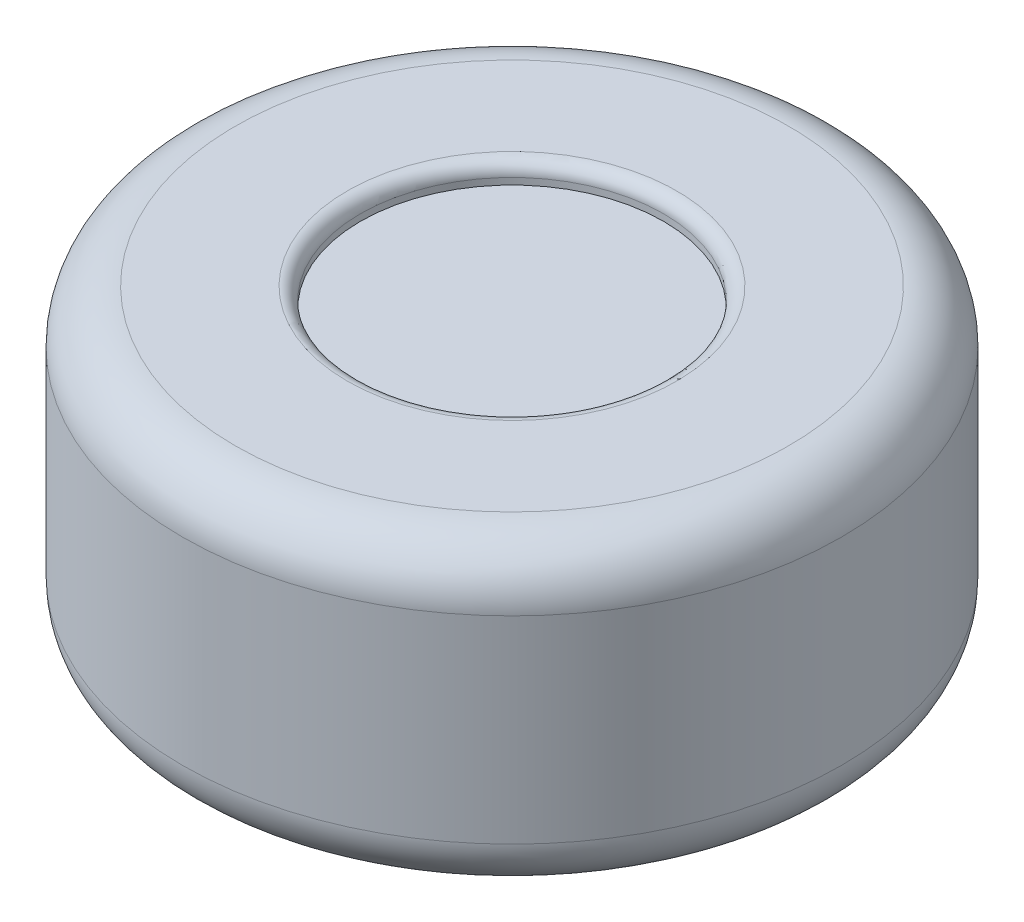
ISO-10303-21;
HEADER;
FILE_DESCRIPTION(('STEP AP214'),'2;1');
FILE_NAME('part.step','',(''),(''),'','','');
FILE_SCHEMA(('AUTOMOTIVE_DESIGN { 1 0 10303 214 1 1 1 1 }'));
ENDSEC;
DATA;
#1=APPLICATION_CONTEXT('core data for automotive mechanical design processes');
#2=APPLICATION_PROTOCOL_DEFINITION('international standard','automotive_design',2000,#1);
#3=PRODUCT_CONTEXT('',#1,'mechanical');
#4=PRODUCT('Part','Part','',(#3));
#5=PRODUCT_RELATED_PRODUCT_CATEGORY('part','',(#4));
#6=PRODUCT_DEFINITION_FORMATION('','',#4);
#7=PRODUCT_DEFINITION_CONTEXT('part definition',#1,'design');
#8=PRODUCT_DEFINITION('design','',#6,#7);
#9=PRODUCT_DEFINITION_SHAPE('','',#8);
#10=(LENGTH_UNIT() NAMED_UNIT(*) SI_UNIT(.MILLI.,.METRE.));
#11=(NAMED_UNIT(*) PLANE_ANGLE_UNIT() SI_UNIT($,.RADIAN.));
#12=(NAMED_UNIT(*) SI_UNIT($,.STERADIAN.) SOLID_ANGLE_UNIT());
#13=UNCERTAINTY_MEASURE_WITH_UNIT(LENGTH_MEASURE(1.E-05),#10,'distance_accuracy_value','');
#14=(GEOMETRIC_REPRESENTATION_CONTEXT(3) GLOBAL_UNCERTAINTY_ASSIGNED_CONTEXT((#13)) GLOBAL_UNIT_ASSIGNED_CONTEXT((#10,
#11,#12)) REPRESENTATION_CONTEXT('',''));
#15=CARTESIAN_POINT('',(0.,0.,0.));
#16=DIRECTION('',(0.,0.,1.));
#17=DIRECTION('',(1.,0.,0.));
#18=AXIS2_PLACEMENT_3D('',#15,#16,#17);
#19=CARTESIAN_POINT('',(0.,-115.,0.));
#20=DIRECTION('',(0.,1.,0.));
#21=DIRECTION('',(0.,0.,1.));
#22=AXIS2_PLACEMENT_3D('',#19,#20,#21);
#23=CYLINDRICAL_SURFACE('',#22,115.);
#24=CARTESIAN_POINT('',(0.,-105.,0.));
#25=DIRECTION('',(0.,1.,0.));
#26=DIRECTION('',(0.,0.,1.));
#27=AXIS2_PLACEMENT_3D('',#24,#25,#26);
#28=CIRCLE('',#27,115.);
#29=CARTESIAN_POINT('',(0.,-105.,115.));
#30=VERTEX_POINT('',#29);
#31=EDGE_CURVE('E50',#30,#30,#28,.F.);
#32=ORIENTED_EDGE('',*,*,#31,.T.);
#33=EDGE_LOOP('',(#32));
#34=FACE_BOUND('',#33,.T.);
#35=CARTESIAN_POINT('',(0.,-100.,0.));
#36=DIRECTION('',(0.,1.,0.));
#37=DIRECTION('',(0.,0.,1.));
#38=AXIS2_PLACEMENT_3D('',#35,#36,#37);
#39=CIRCLE('',#38,115.);
#40=CARTESIAN_POINT('',(0.,-100.,115.));
#41=VERTEX_POINT('',#40);
#42=EDGE_CURVE('E77',#41,#41,#39,.T.);
#43=ORIENTED_EDGE('',*,*,#42,.T.);
#44=EDGE_LOOP('',(#43));
#45=FACE_BOUND('',#44,.T.);
#46=ADVANCED_FACE('F37',(#34,#45),#23,.F.);
#47=CARTESIAN_POINT('',(0.,-115.,0.));
#48=DIRECTION('',(0.,1.,0.));
#49=DIRECTION('',(0.,0.,1.));
#50=AXIS2_PLACEMENT_3D('',#47,#48,#49);
#51=CYLINDRICAL_SURFACE('',#50,250.);
#52=CARTESIAN_POINT('',(0.,75.,0.));
#53=DIRECTION('',(0.,1.,0.));
#54=DIRECTION('',(0.,0.,1.));
#55=AXIS2_PLACEMENT_3D('',#52,#53,#54);
#56=CIRCLE('',#55,250.);
#57=CARTESIAN_POINT('',(0.,75.,250.));
#58=VERTEX_POINT('',#57);
#59=EDGE_CURVE('E65',#58,#58,#56,.F.);
#60=ORIENTED_EDGE('',*,*,#59,.T.);
#61=EDGE_LOOP('',(#60));
#62=FACE_BOUND('',#61,.T.);
#63=CARTESIAN_POINT('',(0.,-75.,0.));
#64=DIRECTION('',(0.,1.,0.));
#65=DIRECTION('',(0.,0.,1.));
#66=AXIS2_PLACEMENT_3D('',#63,#64,#65);
#67=CIRCLE('',#66,250.);
#68=CARTESIAN_POINT('',(0.,-75.,250.));
#69=VERTEX_POINT('',#68);
#70=EDGE_CURVE('E69',#69,#69,#67,.T.);
#71=ORIENTED_EDGE('',*,*,#70,.T.);
#72=EDGE_LOOP('',(#71));
#73=FACE_BOUND('',#72,.T.);
#74=ADVANCED_FACE('F103',(#62,#73),#51,.T.);
#75=CARTESIAN_POINT('',(0.,-115.,0.));
#76=DIRECTION('',(0.,1.,0.));
#77=DIRECTION('',(0.,0.,1.));
#78=AXIS2_PLACEMENT_3D('',#75,#76,#77);
#79=PLANE('',#78);
#80=CARTESIAN_POINT('',(0.,-115.,0.));
#81=DIRECTION('',(0.,1.,0.));
#82=DIRECTION('',(0.,0.,1.));
#83=AXIS2_PLACEMENT_3D('',#80,#81,#82);
#84=CIRCLE('',#83,125.);
#85=CARTESIAN_POINT('',(0.,-115.,125.));
#86=VERTEX_POINT('',#85);
#87=EDGE_CURVE('E55',#86,#86,#84,.T.);
#88=ORIENTED_EDGE('',*,*,#87,.T.);
#89=EDGE_LOOP('',(#88));
#90=FACE_BOUND('',#89,.T.);
#91=CARTESIAN_POINT('',(0.,-115.,0.));
#92=DIRECTION('',(0.,1.,0.));
#93=DIRECTION('',(0.,0.,1.));
#94=AXIS2_PLACEMENT_3D('',#91,#92,#93);
#95=CIRCLE('',#94,210.);
#96=CARTESIAN_POINT('',(0.,-115.,210.));
#97=VERTEX_POINT('',#96);
#98=EDGE_CURVE('E61',#97,#97,#95,.F.);
#99=ORIENTED_EDGE('',*,*,#98,.T.);
#100=EDGE_LOOP('',(#99));
#101=FACE_BOUND('',#100,.T.);
#102=ADVANCED_FACE('F110',(#90,#101),#79,.F.);
#103=CARTESIAN_POINT('',(0.,105.,0.));
#104=DIRECTION('',(0.,1.,0.));
#105=DIRECTION('',(0.,0.,1.));
#106=AXIS2_PLACEMENT_3D('',#103,#104,#105);
#107=CIRCLE('',#106,115.);
#108=CARTESIAN_POINT('',(0.,105.,115.));
#109=VERTEX_POINT('',#108);
#110=EDGE_CURVE('E45',#109,#109,#107,.T.);
#111=ORIENTED_EDGE('',*,*,#110,.T.);
#112=EDGE_LOOP('',(#111));
#113=FACE_BOUND('',#112,.T.);
#114=CARTESIAN_POINT('',(0.,100.,0.));
#115=DIRECTION('',(0.,1.,0.));
#116=DIRECTION('',(0.,0.,1.));
#117=AXIS2_PLACEMENT_3D('',#114,#115,#116);
#118=CIRCLE('',#117,115.);
#119=CARTESIAN_POINT('',(0.,100.,115.));
#120=VERTEX_POINT('',#119);
#121=EDGE_CURVE('E78',#120,#120,#118,.T.);
#122=ORIENTED_EDGE('',*,*,#121,.F.);
#123=EDGE_LOOP('',(#122));
#124=FACE_BOUND('',#123,.T.);
#125=ADVANCED_FACE('F106',(#113,#124),#23,.F.);
#126=CARTESIAN_POINT('',(0.,115.,0.));
#127=DIRECTION('',(0.,1.,0.));
#128=DIRECTION('',(0.,0.,1.));
#129=AXIS2_PLACEMENT_3D('',#126,#127,#128);
#130=PLANE('',#129);
#131=CARTESIAN_POINT('',(0.,115.,0.));
#132=DIRECTION('',(0.,1.,0.));
#133=DIRECTION('',(0.,0.,1.));
#134=AXIS2_PLACEMENT_3D('',#131,#132,#133);
#135=CIRCLE('',#134,125.);
#136=CARTESIAN_POINT('',(0.,115.,125.));
#137=VERTEX_POINT('',#136);
#138=EDGE_CURVE('E10',#137,#137,#135,.F.);
#139=ORIENTED_EDGE('',*,*,#138,.T.);
#140=EDGE_LOOP('',(#139));
#141=FACE_BOUND('',#140,.T.);
#142=CARTESIAN_POINT('',(0.,115.,0.));
#143=DIRECTION('',(0.,1.,0.));
#144=DIRECTION('',(0.,0.,1.));
#145=AXIS2_PLACEMENT_3D('',#142,#143,#144);
#146=CIRCLE('',#145,210.);
#147=CARTESIAN_POINT('',(0.,115.,210.));
#148=VERTEX_POINT('',#147);
#149=EDGE_CURVE('E73',#148,#148,#146,.T.);
#150=ORIENTED_EDGE('',*,*,#149,.T.);
#151=EDGE_LOOP('',(#150));
#152=FACE_BOUND('',#151,.T.);
#153=ADVANCED_FACE('F99',(#141,#152),#130,.T.);
#154=CARTESIAN_POINT('',(0.,100.,0.));
#155=DIRECTION('',(0.,1.,0.));
#156=DIRECTION('',(0.,0.,1.));
#157=AXIS2_PLACEMENT_3D('',#154,#155,#156);
#158=PLANE('',#157);
#159=ORIENTED_EDGE('',*,*,#121,.T.);
#160=EDGE_LOOP('',(#159));
#161=FACE_BOUND('',#160,.T.);
#162=ADVANCED_FACE('F90',(#161),#158,.T.);
#163=CARTESIAN_POINT('',(0.,-100.,0.));
#164=DIRECTION('',(0.,1.,0.));
#165=DIRECTION('',(0.,0.,1.));
#166=AXIS2_PLACEMENT_3D('',#163,#164,#165);
#167=PLANE('',#166);
#168=ORIENTED_EDGE('',*,*,#42,.F.);
#169=EDGE_LOOP('',(#168));
#170=FACE_BOUND('',#169,.T.);
#171=ADVANCED_FACE('F87',(#170),#167,.F.);
#172=CARTESIAN_POINT('',(0.,75.,0.));
#173=DIRECTION('',(0.,1.,0.));
#174=DIRECTION('',(0.,0.,1.));
#175=AXIS2_PLACEMENT_3D('',#172,#173,#174);
#176=TOROIDAL_SURFACE('',#175,210.,40.);
#177=ORIENTED_EDGE('',*,*,#59,.F.);
#178=EDGE_LOOP('',(#177));
#179=FACE_BOUND('',#178,.T.);
#180=ORIENTED_EDGE('',*,*,#149,.F.);
#181=EDGE_LOOP('',(#180));
#182=FACE_BOUND('',#181,.T.);
#183=ADVANCED_FACE('F89',(#179,#182),#176,.T.);
#184=CARTESIAN_POINT('',(0.,-75.,0.));
#185=DIRECTION('',(0.,1.,0.));
#186=DIRECTION('',(0.,0.,1.));
#187=AXIS2_PLACEMENT_3D('',#184,#185,#186);
#188=TOROIDAL_SURFACE('',#187,210.,40.);
#189=ORIENTED_EDGE('',*,*,#98,.F.);
#190=EDGE_LOOP('',(#189));
#191=FACE_BOUND('',#190,.T.);
#192=ORIENTED_EDGE('',*,*,#70,.F.);
#193=EDGE_LOOP('',(#192));
#194=FACE_BOUND('',#193,.T.);
#195=ADVANCED_FACE('F96',(#191,#194),#188,.T.);
#196=CARTESIAN_POINT('',(0.,-105.,0.));
#197=DIRECTION('',(0.,1.,0.));
#198=DIRECTION('',(0.,0.,1.));
#199=AXIS2_PLACEMENT_3D('',#196,#197,#198);
#200=TOROIDAL_SURFACE('',#199,125.,10.);
#201=ORIENTED_EDGE('',*,*,#31,.F.);
#202=EDGE_LOOP('',(#201));
#203=FACE_BOUND('',#202,.T.);
#204=ORIENTED_EDGE('',*,*,#87,.F.);
#205=EDGE_LOOP('',(#204));
#206=FACE_BOUND('',#205,.T.);
#207=ADVANCED_FACE('F131',(#203,#206),#200,.T.);
#208=CARTESIAN_POINT('',(0.,105.,0.));
#209=DIRECTION('',(0.,1.,0.));
#210=DIRECTION('',(0.,0.,1.));
#211=AXIS2_PLACEMENT_3D('',#208,#209,#210);
#212=TOROIDAL_SURFACE('',#211,125.,10.);
#213=ORIENTED_EDGE('',*,*,#138,.F.);
#214=EDGE_LOOP('',(#213));
#215=FACE_BOUND('',#214,.T.);
#216=ORIENTED_EDGE('',*,*,#110,.F.);
#217=EDGE_LOOP('',(#216));
#218=FACE_BOUND('',#217,.T.);
#219=ADVANCED_FACE('F39',(#215,#218),#212,.T.);
#220=CLOSED_SHELL('',(#46,#74,#102,#125,#153,#162,#171,#183,#195,#207,#219));
#221=MANIFOLD_SOLID_BREP('B2',#220);
#222=ADVANCED_BREP_SHAPE_REPRESENTATION('',(#18,#221),#14);
#223=SHAPE_DEFINITION_REPRESENTATION(#9,#222);
ENDSEC;
END-ISO-10303-21;
